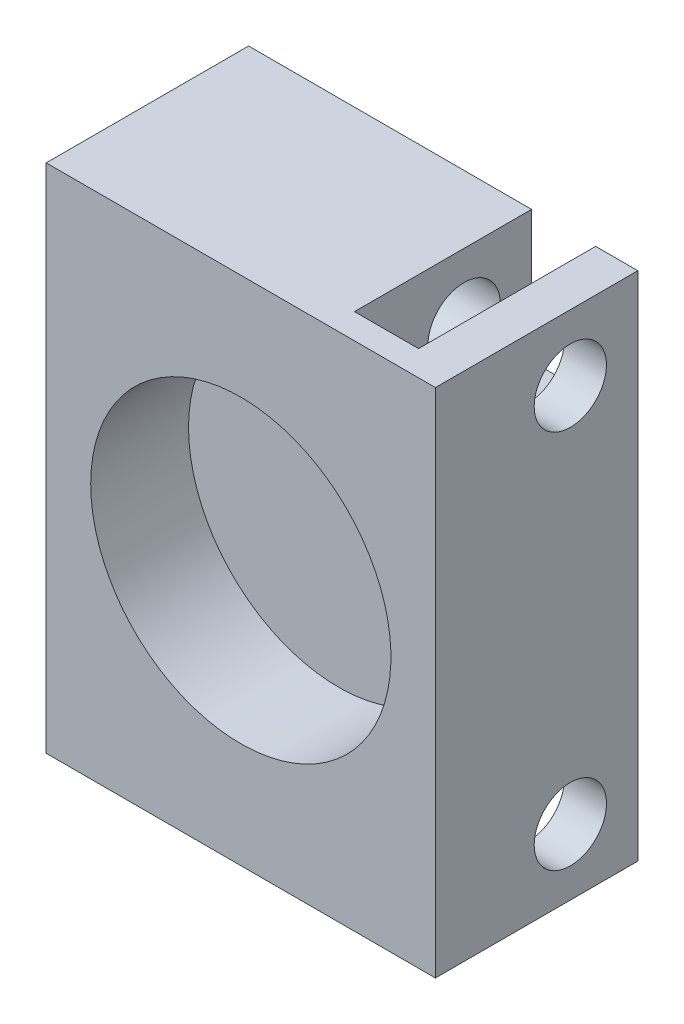
ISO-10303-21;
HEADER;
FILE_DESCRIPTION(('STEP AP214'),'2;1');
FILE_NAME('part.step','',(''),(''),'','','');
FILE_SCHEMA(('AUTOMOTIVE_DESIGN { 1 0 10303 214 1 1 1 1 }'));
ENDSEC;
DATA;
#1=APPLICATION_CONTEXT('core data for automotive mechanical design processes');
#2=APPLICATION_PROTOCOL_DEFINITION('international standard','automotive_design',2000,#1);
#3=PRODUCT_CONTEXT('',#1,'mechanical');
#4=PRODUCT('Part','Part','',(#3));
#5=PRODUCT_RELATED_PRODUCT_CATEGORY('part','',(#4));
#6=PRODUCT_DEFINITION_FORMATION('','',#4);
#7=PRODUCT_DEFINITION_CONTEXT('part definition',#1,'design');
#8=PRODUCT_DEFINITION('design','',#6,#7);
#9=PRODUCT_DEFINITION_SHAPE('','',#8);
#10=(LENGTH_UNIT() NAMED_UNIT(*) SI_UNIT(.MILLI.,.METRE.));
#11=(NAMED_UNIT(*) PLANE_ANGLE_UNIT() SI_UNIT($,.RADIAN.));
#12=(NAMED_UNIT(*) SI_UNIT($,.STERADIAN.) SOLID_ANGLE_UNIT());
#13=UNCERTAINTY_MEASURE_WITH_UNIT(LENGTH_MEASURE(1.E-05),#10,'distance_accuracy_value','');
#14=(GEOMETRIC_REPRESENTATION_CONTEXT(3) GLOBAL_UNCERTAINTY_ASSIGNED_CONTEXT((#13)) GLOBAL_UNIT_ASSIGNED_CONTEXT((#10,
#11,#12)) REPRESENTATION_CONTEXT('',''));
#15=CARTESIAN_POINT('',(0.,0.,0.));
#16=DIRECTION('',(0.,0.,1.));
#17=DIRECTION('',(1.,0.,0.));
#18=AXIS2_PLACEMENT_3D('',#15,#16,#17);
#19=CARTESIAN_POINT('',(0.,0.,0.));
#20=DIRECTION('',(0.,0.,-1.));
#21=DIRECTION('',(-1.,0.,0.));
#22=AXIS2_PLACEMENT_3D('',#19,#20,#21);
#23=PLANE('',#22);
#24=DIRECTION('',(1.,0.,0.));
#25=VECTOR('',#24,1.);
#26=CARTESIAN_POINT('',(-14.6532147419208,-19.2519719410921,0.));
#27=LINE('',#26,#25);
#28=CARTESIAN_POINT('',(11.4782147419208,-19.2519719410921,0.));
#29=VERTEX_POINT('',#28);
#30=CARTESIAN_POINT('',(14.6532147419208,-19.2519719410921,0.));
#31=VERTEX_POINT('',#30);
#32=EDGE_CURVE('E215',#29,#31,#27,.T.);
#33=ORIENTED_EDGE('',*,*,#32,.F.);
#34=DIRECTION('',(0.,1.,0.));
#35=VECTOR('',#34,1.);
#36=CARTESIAN_POINT('',(11.4782147419208,-19.2519719410921,0.));
#37=LINE('',#36,#35);
#38=CARTESIAN_POINT('',(11.4782147419208,-9.34597194109209,0.));
#39=VERTEX_POINT('',#38);
#40=EDGE_CURVE('E431',#29,#39,#37,.T.);
#41=ORIENTED_EDGE('',*,*,#40,.T.);
#42=DIRECTION('',(-1.,0.,0.));
#43=VECTOR('',#42,1.);
#44=CARTESIAN_POINT('',(11.4782147419208,-9.34597194109209,0.));
#45=LINE('',#44,#43);
#46=CARTESIAN_POINT('',(6.65221474192083,-9.34597194109209,0.));
#47=VERTEX_POINT('',#46);
#48=EDGE_CURVE('E439',#39,#47,#45,.T.);
#49=ORIENTED_EDGE('',*,*,#48,.T.);
#50=DIRECTION('',(0.,-1.,0.));
#51=VECTOR('',#50,1.);
#52=CARTESIAN_POINT('',(6.65221474192083,-19.2519719410921,0.));
#53=LINE('',#52,#51);
#54=CARTESIAN_POINT('',(6.65221474192083,-19.2519719410921,0.));
#55=VERTEX_POINT('',#54);
#56=EDGE_CURVE('E434',#47,#55,#53,.T.);
#57=ORIENTED_EDGE('',*,*,#56,.T.);
#58=CARTESIAN_POINT('',(-14.6532147419208,-19.2519719410921,0.));
#59=VERTEX_POINT('',#58);
#60=EDGE_CURVE('E147',#59,#55,#27,.T.);
#61=ORIENTED_EDGE('',*,*,#60,.F.);
#62=DIRECTION('',(0.,-1.,0.));
#63=VECTOR('',#62,1.);
#64=CARTESIAN_POINT('',(-14.6532147419208,-19.2519719410921,0.));
#65=LINE('',#64,#63);
#66=CARTESIAN_POINT('',(-14.6532147419208,19.2519719410921,0.));
#67=VERTEX_POINT('',#66);
#68=EDGE_CURVE('E213',#67,#59,#65,.T.);
#69=ORIENTED_EDGE('',*,*,#68,.F.);
#70=DIRECTION('',(-1.,0.,0.));
#71=VECTOR('',#70,1.);
#72=CARTESIAN_POINT('',(-14.6532147419208,19.2519719410921,0.));
#73=LINE('',#72,#71);
#74=CARTESIAN_POINT('',(6.65221474192083,19.2519719410921,0.));
#75=VERTEX_POINT('',#74);
#76=EDGE_CURVE('E209',#75,#67,#73,.T.);
#77=ORIENTED_EDGE('',*,*,#76,.F.);
#78=DIRECTION('',(0.,1.,0.));
#79=VECTOR('',#78,1.);
#80=CARTESIAN_POINT('',(6.65221474192083,19.2519719410921,0.));
#81=LINE('',#80,#79);
#82=CARTESIAN_POINT('',(6.65221474192083,9.34597194109209,0.));
#83=VERTEX_POINT('',#82);
#84=EDGE_CURVE('E173',#83,#75,#81,.T.);
#85=ORIENTED_EDGE('',*,*,#84,.F.);
#86=DIRECTION('',(-1.,0.,0.));
#87=VECTOR('',#86,1.);
#88=CARTESIAN_POINT('',(11.4782147419208,9.34597194109209,0.));
#89=LINE('',#88,#87);
#90=CARTESIAN_POINT('',(11.4782147419208,9.34597194109209,0.));
#91=VERTEX_POINT('',#90);
#92=EDGE_CURVE('E181',#91,#83,#89,.T.);
#93=ORIENTED_EDGE('',*,*,#92,.F.);
#94=DIRECTION('',(0.,-1.,0.));
#95=VECTOR('',#94,1.);
#96=CARTESIAN_POINT('',(11.4782147419208,19.2519719410921,0.));
#97=LINE('',#96,#95);
#98=CARTESIAN_POINT('',(11.4782147419208,19.2519719410921,0.));
#99=VERTEX_POINT('',#98);
#100=EDGE_CURVE('E168',#99,#91,#97,.T.);
#101=ORIENTED_EDGE('',*,*,#100,.F.);
#102=CARTESIAN_POINT('',(14.6532147419208,19.2519719410921,0.));
#103=VERTEX_POINT('',#102);
#104=EDGE_CURVE('E210',#103,#99,#73,.T.);
#105=ORIENTED_EDGE('',*,*,#104,.F.);
#106=DIRECTION('',(0.,1.,0.));
#107=VECTOR('',#106,1.);
#108=CARTESIAN_POINT('',(14.6532147419208,-19.2519719410921,0.));
#109=LINE('',#108,#107);
#110=EDGE_CURVE('E196',#31,#103,#109,.T.);
#111=ORIENTED_EDGE('',*,*,#110,.F.);
#112=EDGE_LOOP('',(#33,#41,#49,#57,#61,#69,#77,#85,#93,#101,#105,#111));
#113=FACE_BOUND('',#112,.T.);
#114=ADVANCED_FACE('F34',(#113),#23,.T.);
#115=CARTESIAN_POINT('',(-14.6532147419208,-19.2519719410921,15.24));
#116=DIRECTION('',(0.,1.,0.));
#117=DIRECTION('',(0.,0.,1.));
#118=AXIS2_PLACEMENT_3D('',#115,#116,#117);
#119=PLANE('',#118);
#120=DIRECTION('',(0.,0.,-1.));
#121=VECTOR('',#120,1.);
#122=CARTESIAN_POINT('',(11.4782147419208,-19.2519719410921,13.335));
#123=LINE('',#122,#121);
#124=CARTESIAN_POINT('',(11.4782147419208,-19.2519719410921,13.335));
#125=VERTEX_POINT('',#124);
#126=EDGE_CURVE('E148',#125,#29,#123,.T.);
#127=ORIENTED_EDGE('',*,*,#126,.T.);
#128=ORIENTED_EDGE('',*,*,#32,.T.);
#129=DIRECTION('',(0.,0.,-1.));
#130=VECTOR('',#129,1.);
#131=CARTESIAN_POINT('',(14.6532147419208,-19.2519719410921,15.24));
#132=LINE('',#131,#130);
#133=CARTESIAN_POINT('',(14.6532147419208,-19.2519719410921,15.24));
#134=VERTEX_POINT('',#133);
#135=EDGE_CURVE('E206',#134,#31,#132,.T.);
#136=ORIENTED_EDGE('',*,*,#135,.F.);
#137=DIRECTION('',(1.,0.,0.));
#138=VECTOR('',#137,1.);
#139=CARTESIAN_POINT('',(-14.6532147419208,-19.2519719410921,15.24));
#140=LINE('',#139,#138);
#141=CARTESIAN_POINT('',(-14.6532147419208,-19.2519719410921,15.24));
#142=VERTEX_POINT('',#141);
#143=EDGE_CURVE('E204',#142,#134,#140,.T.);
#144=ORIENTED_EDGE('',*,*,#143,.F.);
#145=DIRECTION('',(0.,0.,-1.));
#146=VECTOR('',#145,1.);
#147=CARTESIAN_POINT('',(-14.6532147419208,-19.2519719410921,15.24));
#148=LINE('',#147,#146);
#149=EDGE_CURVE('E219',#142,#59,#148,.T.);
#150=ORIENTED_EDGE('',*,*,#149,.T.);
#151=ORIENTED_EDGE('',*,*,#60,.T.);
#152=DIRECTION('',(0.,0.,-1.));
#153=VECTOR('',#152,1.);
#154=CARTESIAN_POINT('',(6.65221474192083,-19.2519719410921,13.335));
#155=LINE('',#154,#153);
#156=CARTESIAN_POINT('',(6.65221474192083,-19.2519719410921,13.335));
#157=VERTEX_POINT('',#156);
#158=EDGE_CURVE('E132',#157,#55,#155,.T.);
#159=ORIENTED_EDGE('',*,*,#158,.F.);
#160=DIRECTION('',(1.,0.,0.));
#161=VECTOR('',#160,1.);
#162=CARTESIAN_POINT('',(11.4782147419208,-19.2519719410921,13.335));
#163=LINE('',#162,#161);
#164=EDGE_CURVE('E136',#157,#125,#163,.T.);
#165=ORIENTED_EDGE('',*,*,#164,.T.);
#166=EDGE_LOOP('',(#127,#128,#136,#144,#150,#151,#159,#165));
#167=FACE_BOUND('',#166,.T.);
#168=ADVANCED_FACE('F144',(#167),#119,.F.);
#169=CARTESIAN_POINT('',(0.,0.,15.24));
#170=DIRECTION('',(0.,0.,-1.));
#171=DIRECTION('',(-1.,0.,0.));
#172=AXIS2_PLACEMENT_3D('',#169,#170,#171);
#173=CYLINDRICAL_SURFACE('',#172,11.303);
#174=CARTESIAN_POINT('',(0.,0.,15.24));
#175=DIRECTION('',(0.,0.,1.));
#176=DIRECTION('',(1.,0.,0.));
#177=AXIS2_PLACEMENT_3D('',#174,#175,#176);
#178=CIRCLE('',#177,11.303);
#179=CARTESIAN_POINT('',(-11.303,0.,15.24));
#180=VERTEX_POINT('',#179);
#181=EDGE_CURVE('E187',#180,#180,#178,.T.);
#182=CARTESIAN_POINT('',(0.,0.,7.874));
#183=DIRECTION('',(0.,0.,-1.));
#184=DIRECTION('',(-1.,0.,0.));
#185=AXIS2_PLACEMENT_3D('',#182,#183,#184);
#186=CIRCLE('',#185,11.303);
#187=CARTESIAN_POINT('',(-11.303,0.,7.874));
#188=VERTEX_POINT('',#187);
#189=EDGE_CURVE('E165',#188,#188,#186,.T.);
#190=CARTESIAN_POINT('',(-11.303,0.,15.24));
#191=CARTESIAN_POINT('',(-11.303,0.,15.1632708333333));
#192=CARTESIAN_POINT('',(-11.303,0.,15.0865416666667));
#193=CARTESIAN_POINT('',(-11.303,0.,14.9330833333333));
#194=CARTESIAN_POINT('',(-11.303,0.,14.8563541666667));
#195=CARTESIAN_POINT('',(-11.303,0.,14.7028958333333));
#196=CARTESIAN_POINT('',(-11.303,0.,14.6261666666667));
#197=CARTESIAN_POINT('',(-11.303,0.,14.4727083333333));
#198=CARTESIAN_POINT('',(-11.303,0.,14.3959791666667));
#199=CARTESIAN_POINT('',(-11.303,0.,14.2425208333333));
#200=CARTESIAN_POINT('',(-11.303,0.,14.1657916666667));
#201=CARTESIAN_POINT('',(-11.303,0.,14.0123333333333));
#202=CARTESIAN_POINT('',(-11.303,0.,13.9356041666667));
#203=CARTESIAN_POINT('',(-11.303,0.,13.7821458333333));
#204=CARTESIAN_POINT('',(-11.303,0.,13.7054166666667));
#205=CARTESIAN_POINT('',(-11.303,0.,13.5519583333333));
#206=CARTESIAN_POINT('',(-11.303,0.,13.4752291666667));
#207=CARTESIAN_POINT('',(-11.303,0.,13.3217708333333));
#208=CARTESIAN_POINT('',(-11.303,0.,13.2450416666667));
#209=CARTESIAN_POINT('',(-11.303,0.,13.0915833333333));
#210=CARTESIAN_POINT('',(-11.303,0.,13.0148541666667));
#211=CARTESIAN_POINT('',(-11.303,0.,12.8613958333333));
#212=CARTESIAN_POINT('',(-11.303,0.,12.7846666666667));
#213=CARTESIAN_POINT('',(-11.303,0.,12.6312083333333));
#214=CARTESIAN_POINT('',(-11.303,0.,12.5544791666667));
#215=CARTESIAN_POINT('',(-11.303,0.,12.4010208333333));
#216=CARTESIAN_POINT('',(-11.303,0.,12.3242916666667));
#217=CARTESIAN_POINT('',(-11.303,0.,12.1708333333333));
#218=CARTESIAN_POINT('',(-11.303,0.,12.0941041666667));
#219=CARTESIAN_POINT('',(-11.303,0.,11.9406458333333));
#220=CARTESIAN_POINT('',(-11.303,0.,11.8639166666667));
#221=CARTESIAN_POINT('',(-11.303,0.,11.7104583333333));
#222=CARTESIAN_POINT('',(-11.303,0.,11.6337291666667));
#223=CARTESIAN_POINT('',(-11.303,0.,11.4802708333333));
#224=CARTESIAN_POINT('',(-11.303,0.,11.4035416666667));
#225=CARTESIAN_POINT('',(-11.303,0.,11.2500833333333));
#226=CARTESIAN_POINT('',(-11.303,0.,11.1733541666667));
#227=CARTESIAN_POINT('',(-11.303,0.,11.0198958333333));
#228=CARTESIAN_POINT('',(-11.303,0.,10.9431666666667));
#229=CARTESIAN_POINT('',(-11.303,0.,10.7897083333333));
#230=CARTESIAN_POINT('',(-11.303,0.,10.7129791666667));
#231=CARTESIAN_POINT('',(-11.303,0.,10.5595208333333));
#232=CARTESIAN_POINT('',(-11.303,0.,10.4827916666667));
#233=CARTESIAN_POINT('',(-11.303,0.,10.3293333333333));
#234=CARTESIAN_POINT('',(-11.303,0.,10.2526041666667));
#235=CARTESIAN_POINT('',(-11.303,0.,10.0991458333333));
#236=CARTESIAN_POINT('',(-11.303,0.,10.0224166666667));
#237=CARTESIAN_POINT('',(-11.303,0.,9.86895833333333));
#238=CARTESIAN_POINT('',(-11.303,0.,9.79222916666667));
#239=CARTESIAN_POINT('',(-11.303,0.,9.63877083333333));
#240=CARTESIAN_POINT('',(-11.303,0.,9.56204166666667));
#241=CARTESIAN_POINT('',(-11.303,0.,9.40858333333333));
#242=CARTESIAN_POINT('',(-11.303,0.,9.33185416666667));
#243=CARTESIAN_POINT('',(-11.303,0.,9.17839583333333));
#244=CARTESIAN_POINT('',(-11.303,0.,9.10166666666667));
#245=CARTESIAN_POINT('',(-11.303,0.,8.94820833333333));
#246=CARTESIAN_POINT('',(-11.303,0.,8.87147916666667));
#247=CARTESIAN_POINT('',(-11.303,0.,8.71802083333333));
#248=CARTESIAN_POINT('',(-11.303,0.,8.64129166666667));
#249=CARTESIAN_POINT('',(-11.303,0.,8.48783333333333));
#250=CARTESIAN_POINT('',(-11.303,0.,8.41110416666667));
#251=CARTESIAN_POINT('',(-11.303,0.,8.25764583333333));
#252=CARTESIAN_POINT('',(-11.303,0.,8.18091666666667));
#253=CARTESIAN_POINT('',(-11.303,0.,8.02745833333333));
#254=CARTESIAN_POINT('',(-11.303,0.,7.95072916666667));
#255=CARTESIAN_POINT('',(-11.303,0.,7.874));
#256=B_SPLINE_CURVE_WITH_KNOTS('',3,(#190,#191,#192,#193,#194,#195,#196,#197,#198,#199,#200,
#201,#202,#203,#204,#205,#206,#207,#208,#209,#210,#211,#212,#213,#214,#215,#216,#217,#218,#219,
#220,#221,#222,#223,#224,#225,#226,#227,#228,#229,#230,#231,#232,#233,#234,#235,#236,#237,#238,
#239,#240,#241,#242,#243,#244,#245,#246,#247,#248,#249,#250,#251,#252,#253,#254,#255),
.UNSPECIFIED.,.F.,.F.,(4,2,2,2,2,2,2,2,2,2,2,2,2,2,2,2,2,2,2,2,2,2,2,2,2,2,2,2,2,2,2,2,4),(0.,
0.230187500000001,0.460375000000001,0.6905625,0.92075,1.1509375,1.381125,1.6113125,1.8415,
2.0716875,2.301875,2.5320625,2.76225,2.9924375,3.222625,3.4528125,3.683,3.9131875,4.143375,
4.3735625,4.60375,4.8339375,5.064125,5.2943125,5.5245,5.7546875,5.984875,6.2150625,6.44525,
6.6754375,6.905625,7.1358125,7.366),.UNSPECIFIED.);
#257=EDGE_CURVE('BSEAM250',#180,#188,#256,.T.);
#258=ORIENTED_EDGE('',*,*,#181,.T.);
#259=ORIENTED_EDGE('',*,*,#189,.T.);
#260=ORIENTED_EDGE('',*,*,#257,.T.);
#261=ORIENTED_EDGE('',*,*,#257,.F.);
#262=EDGE_LOOP('',(#258,#260,#259,#261));
#263=FACE_BOUND('',#262,.T.);
#264=ADVANCED_FACE('F250',(#263),#173,.F.);
#265=CARTESIAN_POINT('',(0.,0.,15.24));
#266=DIRECTION('',(0.,0.,-1.));
#267=DIRECTION('',(-1.,0.,0.));
#268=AXIS2_PLACEMENT_3D('',#265,#266,#267);
#269=PLANE('',#268);
#270=DIRECTION('',(0.,1.,0.));
#271=VECTOR('',#270,1.);
#272=CARTESIAN_POINT('',(14.6532147419208,-19.2519719410921,15.24));
#273=LINE('',#272,#271);
#274=CARTESIAN_POINT('',(14.6532147419208,19.2519719410921,15.24));
#275=VERTEX_POINT('',#274);
#276=EDGE_CURVE('E197',#134,#275,#273,.T.);
#277=ORIENTED_EDGE('',*,*,#276,.T.);
#278=DIRECTION('',(-1.,0.,0.));
#279=VECTOR('',#278,1.);
#280=CARTESIAN_POINT('',(-14.6532147419208,19.2519719410921,15.24));
#281=LINE('',#280,#279);
#282=CARTESIAN_POINT('',(-14.6532147419208,19.2519719410921,15.24));
#283=VERTEX_POINT('',#282);
#284=EDGE_CURVE('E200',#275,#283,#281,.T.);
#285=ORIENTED_EDGE('',*,*,#284,.T.);
#286=DIRECTION('',(0.,-1.,0.));
#287=VECTOR('',#286,1.);
#288=CARTESIAN_POINT('',(-14.6532147419208,-19.2519719410921,15.24));
#289=LINE('',#288,#287);
#290=EDGE_CURVE('E202',#283,#142,#289,.T.);
#291=ORIENTED_EDGE('',*,*,#290,.T.);
#292=ORIENTED_EDGE('',*,*,#143,.T.);
#293=EDGE_LOOP('',(#277,#285,#291,#292));
#294=FACE_BOUND('',#293,.T.);
#295=ORIENTED_EDGE('',*,*,#181,.F.);
#296=EDGE_LOOP('',(#295));
#297=FACE_BOUND('',#296,.T.);
#298=ADVANCED_FACE('F254',(#294,#297),#269,.F.);
#299=CARTESIAN_POINT('',(14.6532147419208,-19.2519719410921,15.24));
#300=DIRECTION('',(-1.,0.,0.));
#301=DIRECTION('',(0.,0.,1.));
#302=AXIS2_PLACEMENT_3D('',#299,#300,#301);
#303=PLANE('',#302);
#304=CARTESIAN_POINT('',(14.6532147419208,-14.2989719410921,5.08));
#305=DIRECTION('',(-1.,0.,0.));
#306=DIRECTION('',(0.,0.,1.));
#307=AXIS2_PLACEMENT_3D('',#304,#305,#306);
#308=CIRCLE('',#307,2.72177012151882);
#309=CARTESIAN_POINT('',(14.6532147419208,-14.2989719410921,7.80177012151882));
#310=VERTEX_POINT('',#309);
#311=EDGE_CURVE('E430',#310,#310,#308,.F.);
#312=ORIENTED_EDGE('',*,*,#311,.F.);
#313=EDGE_LOOP('',(#312));
#314=FACE_BOUND('',#313,.T.);
#315=CARTESIAN_POINT('',(14.6532147419208,14.2989719410921,5.08));
#316=DIRECTION('',(-1.,0.,0.));
#317=DIRECTION('',(0.,0.,1.));
#318=AXIS2_PLACEMENT_3D('',#315,#316,#317);
#319=CIRCLE('',#318,2.72177012151882);
#320=CARTESIAN_POINT('',(14.6532147419208,14.2989719410921,7.80177012151882));
#321=VERTEX_POINT('',#320);
#322=EDGE_CURVE('E162',#321,#321,#319,.T.);
#323=ORIENTED_EDGE('',*,*,#322,.T.);
#324=EDGE_LOOP('',(#323));
#325=FACE_BOUND('',#324,.T.);
#326=ORIENTED_EDGE('',*,*,#110,.T.);
#327=DIRECTION('',(0.,0.,-1.));
#328=VECTOR('',#327,1.);
#329=CARTESIAN_POINT('',(14.6532147419208,19.2519719410921,15.24));
#330=LINE('',#329,#328);
#331=EDGE_CURVE('E11',#275,#103,#330,.T.);
#332=ORIENTED_EDGE('',*,*,#331,.F.);
#333=ORIENTED_EDGE('',*,*,#276,.F.);
#334=ORIENTED_EDGE('',*,*,#135,.T.);
#335=EDGE_LOOP('',(#326,#332,#333,#334));
#336=FACE_BOUND('',#335,.T.);
#337=ADVANCED_FACE('F36',(#314,#325,#336),#303,.F.);
#338=CARTESIAN_POINT('',(-14.6532147419208,19.2519719410921,15.24));
#339=DIRECTION('',(0.,-1.,0.));
#340=DIRECTION('',(1.,0.,0.));
#341=AXIS2_PLACEMENT_3D('',#338,#339,#340);
#342=PLANE('',#341);
#343=ORIENTED_EDGE('',*,*,#104,.T.);
#344=DIRECTION('',(0.,0.,-1.));
#345=VECTOR('',#344,1.);
#346=CARTESIAN_POINT('',(11.4782147419208,19.2519719410921,13.335));
#347=LINE('',#346,#345);
#348=CARTESIAN_POINT('',(11.4782147419208,19.2519719410921,13.335));
#349=VERTEX_POINT('',#348);
#350=EDGE_CURVE('E185',#349,#99,#347,.T.);
#351=ORIENTED_EDGE('',*,*,#350,.F.);
#352=DIRECTION('',(1.,0.,0.));
#353=VECTOR('',#352,1.);
#354=CARTESIAN_POINT('',(11.4782147419208,19.2519719410921,13.335));
#355=LINE('',#354,#353);
#356=CARTESIAN_POINT('',(6.65221474192084,19.2519719410921,13.335));
#357=VERTEX_POINT('',#356);
#358=EDGE_CURVE('E176',#357,#349,#355,.T.);
#359=ORIENTED_EDGE('',*,*,#358,.F.);
#360=DIRECTION('',(0.,0.,-1.));
#361=VECTOR('',#360,1.);
#362=CARTESIAN_POINT('',(6.65221474192083,19.2519719410921,13.335));
#363=LINE('',#362,#361);
#364=EDGE_CURVE('E188',#357,#75,#363,.T.);
#365=ORIENTED_EDGE('',*,*,#364,.T.);
#366=ORIENTED_EDGE('',*,*,#76,.T.);
#367=DIRECTION('',(0.,0.,-1.));
#368=VECTOR('',#367,1.);
#369=CARTESIAN_POINT('',(-14.6532147419208,19.2519719410921,15.24));
#370=LINE('',#369,#368);
#371=EDGE_CURVE('E43',#283,#67,#370,.T.);
#372=ORIENTED_EDGE('',*,*,#371,.F.);
#373=ORIENTED_EDGE('',*,*,#284,.F.);
#374=ORIENTED_EDGE('',*,*,#331,.T.);
#375=EDGE_LOOP('',(#343,#351,#359,#365,#366,#372,#373,#374));
#376=FACE_BOUND('',#375,.T.);
#377=ADVANCED_FACE('F260',(#376),#342,.F.);
#378=CARTESIAN_POINT('',(-14.6532147419208,-19.2519719410921,15.24));
#379=DIRECTION('',(1.,0.,0.));
#380=DIRECTION('',(0.,0.,-1.));
#381=AXIS2_PLACEMENT_3D('',#378,#379,#380);
#382=PLANE('',#381);
#383=CARTESIAN_POINT('',(-14.6532147419208,-14.2989719410921,5.08));
#384=DIRECTION('',(1.,0.,0.));
#385=DIRECTION('',(0.,0.,1.));
#386=AXIS2_PLACEMENT_3D('',#383,#384,#385);
#387=CIRCLE('',#386,2.72177012151882);
#388=CARTESIAN_POINT('',(-14.6532147419208,-14.2989719410921,7.80177012151882));
#389=VERTEX_POINT('',#388);
#390=EDGE_CURVE('E447',#389,#389,#387,.T.);
#391=ORIENTED_EDGE('',*,*,#390,.T.);
#392=EDGE_LOOP('',(#391));
#393=FACE_BOUND('',#392,.T.);
#394=CARTESIAN_POINT('',(-14.6532147419208,14.2989719410921,5.08));
#395=DIRECTION('',(-1.,0.,0.));
#396=DIRECTION('',(0.,0.,1.));
#397=AXIS2_PLACEMENT_3D('',#394,#395,#396);
#398=CIRCLE('',#397,2.72177012151882);
#399=CARTESIAN_POINT('',(-14.6532147419208,14.2989719410921,7.80177012151882));
#400=VERTEX_POINT('',#399);
#401=EDGE_CURVE('E155',#400,#400,#398,.T.);
#402=ORIENTED_EDGE('',*,*,#401,.F.);
#403=EDGE_LOOP('',(#402));
#404=FACE_BOUND('',#403,.T.);
#405=ORIENTED_EDGE('',*,*,#68,.T.);
#406=ORIENTED_EDGE('',*,*,#149,.F.);
#407=ORIENTED_EDGE('',*,*,#290,.F.);
#408=ORIENTED_EDGE('',*,*,#371,.T.);
#409=EDGE_LOOP('',(#405,#406,#407,#408));
#410=FACE_BOUND('',#409,.T.);
#411=ADVANCED_FACE('F257',(#393,#404,#410),#382,.F.);
#412=CARTESIAN_POINT('',(11.4782147419208,19.2519719410921,13.335));
#413=DIRECTION('',(1.,0.,0.));
#414=DIRECTION('',(0.,1.,0.));
#415=AXIS2_PLACEMENT_3D('',#412,#413,#414);
#416=PLANE('',#415);
#417=CARTESIAN_POINT('',(11.4782147419208,14.2989719410921,5.08));
#418=DIRECTION('',(1.,0.,0.));
#419=DIRECTION('',(0.,1.,0.));
#420=AXIS2_PLACEMENT_3D('',#417,#418,#419);
#421=CIRCLE('',#420,2.72177012151882);
#422=CARTESIAN_POINT('',(11.4782147419208,14.2989719410921,7.80177012151882));
#423=VERTEX_POINT('',#422);
#424=EDGE_CURVE('E159',#423,#423,#421,.T.);
#425=ORIENTED_EDGE('',*,*,#424,.T.);
#426=EDGE_LOOP('',(#425));
#427=FACE_BOUND('',#426,.T.);
#428=ORIENTED_EDGE('',*,*,#100,.T.);
#429=DIRECTION('',(0.,0.,-1.));
#430=VECTOR('',#429,1.);
#431=CARTESIAN_POINT('',(11.4782147419208,9.34597194109209,13.335));
#432=LINE('',#431,#430);
#433=CARTESIAN_POINT('',(11.4782147419208,9.34597194109209,13.335));
#434=VERTEX_POINT('',#433);
#435=EDGE_CURVE('E178',#434,#91,#432,.T.);
#436=ORIENTED_EDGE('',*,*,#435,.F.);
#437=DIRECTION('',(0.,-1.,0.));
#438=VECTOR('',#437,1.);
#439=CARTESIAN_POINT('',(11.4782147419208,19.2519719410921,13.335));
#440=LINE('',#439,#438);
#441=EDGE_CURVE('E169',#349,#434,#440,.T.);
#442=ORIENTED_EDGE('',*,*,#441,.F.);
#443=ORIENTED_EDGE('',*,*,#350,.T.);
#444=EDGE_LOOP('',(#428,#436,#442,#443));
#445=FACE_BOUND('',#444,.T.);
#446=ADVANCED_FACE('F259',(#427,#445),#416,.F.);
#447=CARTESIAN_POINT('',(6.65221474192083,19.2519719410921,13.335));
#448=DIRECTION('',(-1.,0.,0.));
#449=DIRECTION('',(0.,-1.,0.));
#450=AXIS2_PLACEMENT_3D('',#447,#448,#449);
#451=PLANE('',#450);
#452=CARTESIAN_POINT('',(6.65221474192083,14.2989719410921,5.08));
#453=DIRECTION('',(-1.,0.,0.));
#454=DIRECTION('',(0.,-1.,0.));
#455=AXIS2_PLACEMENT_3D('',#452,#453,#454);
#456=CIRCLE('',#455,2.72177012151882);
#457=CARTESIAN_POINT('',(6.65221474192083,11.5772018195733,5.08));
#458=VERTEX_POINT('',#457);
#459=EDGE_CURVE('E158',#458,#458,#456,.T.);
#460=ORIENTED_EDGE('',*,*,#459,.T.);
#461=EDGE_LOOP('',(#460));
#462=FACE_BOUND('',#461,.T.);
#463=ORIENTED_EDGE('',*,*,#84,.T.);
#464=ORIENTED_EDGE('',*,*,#364,.F.);
#465=DIRECTION('',(0.,1.,0.));
#466=VECTOR('',#465,1.);
#467=CARTESIAN_POINT('',(6.65221474192083,19.2519719410921,13.335));
#468=LINE('',#467,#466);
#469=CARTESIAN_POINT('',(6.65221474192083,9.34597194109209,13.335));
#470=VERTEX_POINT('',#469);
#471=EDGE_CURVE('E59',#470,#357,#468,.T.);
#472=ORIENTED_EDGE('',*,*,#471,.F.);
#473=DIRECTION('',(0.,0.,-1.));
#474=VECTOR('',#473,1.);
#475=CARTESIAN_POINT('',(6.65221474192083,9.34597194109209,13.335));
#476=LINE('',#475,#474);
#477=EDGE_CURVE('E191',#470,#83,#476,.T.);
#478=ORIENTED_EDGE('',*,*,#477,.T.);
#479=EDGE_LOOP('',(#463,#464,#472,#478));
#480=FACE_BOUND('',#479,.T.);
#481=ADVANCED_FACE('F225',(#462,#480),#451,.F.);
#482=CARTESIAN_POINT('',(11.4782147419208,9.34597194109209,13.335));
#483=DIRECTION('',(0.,-1.,0.));
#484=DIRECTION('',(1.,0.,0.));
#485=AXIS2_PLACEMENT_3D('',#482,#483,#484);
#486=PLANE('',#485);
#487=ORIENTED_EDGE('',*,*,#92,.T.);
#488=ORIENTED_EDGE('',*,*,#477,.F.);
#489=DIRECTION('',(-1.,0.,0.));
#490=VECTOR('',#489,1.);
#491=CARTESIAN_POINT('',(11.4782147419208,9.34597194109209,13.335));
#492=LINE('',#491,#490);
#493=EDGE_CURVE('E172',#434,#470,#492,.T.);
#494=ORIENTED_EDGE('',*,*,#493,.F.);
#495=ORIENTED_EDGE('',*,*,#435,.T.);
#496=EDGE_LOOP('',(#487,#488,#494,#495));
#497=FACE_BOUND('',#496,.T.);
#498=ADVANCED_FACE('F301',(#497),#486,.F.);
#499=CARTESIAN_POINT('',(0.,0.,13.335));
#500=DIRECTION('',(0.,0.,-1.));
#501=DIRECTION('',(-1.,0.,0.));
#502=AXIS2_PLACEMENT_3D('',#499,#500,#501);
#503=PLANE('',#502);
#504=ORIENTED_EDGE('',*,*,#441,.T.);
#505=ORIENTED_EDGE('',*,*,#493,.T.);
#506=ORIENTED_EDGE('',*,*,#471,.T.);
#507=ORIENTED_EDGE('',*,*,#358,.T.);
#508=EDGE_LOOP('',(#504,#505,#506,#507));
#509=FACE_BOUND('',#508,.T.);
#510=ADVANCED_FACE('F240',(#509),#503,.T.);
#511=CARTESIAN_POINT('',(0.,0.,7.874));
#512=DIRECTION('',(0.,0.,-1.));
#513=DIRECTION('',(-1.,0.,0.));
#514=AXIS2_PLACEMENT_3D('',#511,#512,#513);
#515=PLANE('',#514);
#516=ORIENTED_EDGE('',*,*,#189,.F.);
#517=EDGE_LOOP('',(#516));
#518=FACE_BOUND('',#517,.T.);
#519=ADVANCED_FACE('F231',(#518),#515,.F.);
#520=CARTESIAN_POINT('',(17.0967852580792,14.2989719410921,5.08));
#521=DIRECTION('',(-1.,0.,0.));
#522=DIRECTION('',(0.,0.,1.));
#523=AXIS2_PLACEMENT_3D('',#520,#521,#522);
#524=CYLINDRICAL_SURFACE('',#523,2.72177012151882);
#525=ORIENTED_EDGE('',*,*,#401,.T.);
#526=EDGE_LOOP('',(#525));
#527=FACE_BOUND('',#526,.T.);
#528=ORIENTED_EDGE('',*,*,#459,.F.);
#529=EDGE_LOOP('',(#528));
#530=FACE_BOUND('',#529,.T.);
#531=ADVANCED_FACE('F228',(#527,#530),#524,.F.);
#532=CARTESIAN_POINT('',(11.4782147419208,14.2989719410921,7.80177012151882));
#533=CARTESIAN_POINT('',(11.5112876585875,14.2989719410921,7.80177012151882));
#534=CARTESIAN_POINT('',(11.5443605752542,14.2989719410921,7.80177012151882));
#535=CARTESIAN_POINT('',(11.6105064085875,14.2989719410921,7.80177012151882));
#536=CARTESIAN_POINT('',(11.6435793252542,14.2989719410921,7.80177012151882));
#537=CARTESIAN_POINT('',(11.7097251585875,14.2989719410921,7.80177012151882));
#538=CARTESIAN_POINT('',(11.7427980752542,14.2989719410921,7.80177012151882));
#539=CARTESIAN_POINT('',(11.8089439085875,14.2989719410921,7.80177012151882));
#540=CARTESIAN_POINT('',(11.8420168252542,14.2989719410921,7.80177012151882));
#541=CARTESIAN_POINT('',(11.9081626585875,14.2989719410921,7.80177012151882));
#542=CARTESIAN_POINT('',(11.9412355752542,14.2989719410921,7.80177012151882));
#543=CARTESIAN_POINT('',(12.0073814085875,14.2989719410921,7.80177012151882));
#544=CARTESIAN_POINT('',(12.0404543252542,14.2989719410921,7.80177012151882));
#545=CARTESIAN_POINT('',(12.1066001585875,14.2989719410921,7.80177012151882));
#546=CARTESIAN_POINT('',(12.1396730752542,14.2989719410921,7.80177012151882));
#547=CARTESIAN_POINT('',(12.2058189085875,14.2989719410921,7.80177012151882));
#548=CARTESIAN_POINT('',(12.2388918252542,14.2989719410921,7.80177012151882));
#549=CARTESIAN_POINT('',(12.3050376585875,14.2989719410921,7.80177012151882));
#550=CARTESIAN_POINT('',(12.3381105752542,14.2989719410921,7.80177012151882));
#551=CARTESIAN_POINT('',(12.4042564085875,14.2989719410921,7.80177012151882));
#552=CARTESIAN_POINT('',(12.4373293252542,14.2989719410921,7.80177012151882));
#553=CARTESIAN_POINT('',(12.5034751585875,14.2989719410921,7.80177012151882));
#554=CARTESIAN_POINT('',(12.5365480752542,14.2989719410921,7.80177012151882));
#555=CARTESIAN_POINT('',(12.6026939085875,14.2989719410921,7.80177012151882));
#556=CARTESIAN_POINT('',(12.6357668252542,14.2989719410921,7.80177012151882));
#557=CARTESIAN_POINT('',(12.7019126585875,14.2989719410921,7.80177012151882));
#558=CARTESIAN_POINT('',(12.7349855752542,14.2989719410921,7.80177012151882));
#559=CARTESIAN_POINT('',(12.8011314085875,14.2989719410921,7.80177012151882));
#560=CARTESIAN_POINT('',(12.8342043252542,14.2989719410921,7.80177012151882));
#561=CARTESIAN_POINT('',(12.9003501585875,14.2989719410921,7.80177012151882));
#562=CARTESIAN_POINT('',(12.9334230752542,14.2989719410921,7.80177012151882));
#563=CARTESIAN_POINT('',(12.9995689085875,14.2989719410921,7.80177012151882));
#564=CARTESIAN_POINT('',(13.0326418252542,14.2989719410921,7.80177012151882));
#565=CARTESIAN_POINT('',(13.0987876585875,14.2989719410921,7.80177012151882));
#566=CARTESIAN_POINT('',(13.1318605752542,14.2989719410921,7.80177012151882));
#567=CARTESIAN_POINT('',(13.1980064085875,14.2989719410921,7.80177012151882));
#568=CARTESIAN_POINT('',(13.2310793252542,14.2989719410921,7.80177012151882));
#569=CARTESIAN_POINT('',(13.2972251585875,14.2989719410921,7.80177012151882));
#570=CARTESIAN_POINT('',(13.3302980752542,14.2989719410921,7.80177012151882));
#571=CARTESIAN_POINT('',(13.3964439085875,14.2989719410921,7.80177012151882));
#572=CARTESIAN_POINT('',(13.4295168252542,14.2989719410921,7.80177012151882));
#573=CARTESIAN_POINT('',(13.4956626585875,14.2989719410921,7.80177012151882));
#574=CARTESIAN_POINT('',(13.5287355752542,14.2989719410921,7.80177012151882));
#575=CARTESIAN_POINT('',(13.5948814085875,14.2989719410921,7.80177012151882));
#576=CARTESIAN_POINT('',(13.6279543252542,14.2989719410921,7.80177012151882));
#577=CARTESIAN_POINT('',(13.6941001585875,14.2989719410921,7.80177012151882));
#578=CARTESIAN_POINT('',(13.7271730752542,14.2989719410921,7.80177012151882));
#579=CARTESIAN_POINT('',(13.7933189085875,14.2989719410921,7.80177012151882));
#580=CARTESIAN_POINT('',(13.8263918252542,14.2989719410921,7.80177012151882));
#581=CARTESIAN_POINT('',(13.8925376585875,14.2989719410921,7.80177012151882));
#582=CARTESIAN_POINT('',(13.9256105752542,14.2989719410921,7.80177012151882));
#583=CARTESIAN_POINT('',(13.9917564085875,14.2989719410921,7.80177012151882));
#584=CARTESIAN_POINT('',(14.0248293252542,14.2989719410921,7.80177012151882));
#585=CARTESIAN_POINT('',(14.0909751585875,14.2989719410921,7.80177012151882));
#586=CARTESIAN_POINT('',(14.1240480752542,14.2989719410921,7.80177012151882));
#587=CARTESIAN_POINT('',(14.1901939085875,14.2989719410921,7.80177012151882));
#588=CARTESIAN_POINT('',(14.2232668252542,14.2989719410921,7.80177012151882));
#589=CARTESIAN_POINT('',(14.2894126585875,14.2989719410921,7.80177012151882));
#590=CARTESIAN_POINT('',(14.3224855752542,14.2989719410921,7.80177012151882));
#591=CARTESIAN_POINT('',(14.3886314085875,14.2989719410921,7.80177012151882));
#592=CARTESIAN_POINT('',(14.4217043252542,14.2989719410921,7.80177012151882));
#593=CARTESIAN_POINT('',(14.4878501585875,14.2989719410921,7.80177012151882));
#594=CARTESIAN_POINT('',(14.5209230752542,14.2989719410921,7.80177012151882));
#595=CARTESIAN_POINT('',(14.5870689085875,14.2989719410921,7.80177012151882));
#596=CARTESIAN_POINT('',(14.6201418252542,14.2989719410921,7.80177012151882));
#597=CARTESIAN_POINT('',(14.6532147419208,14.2989719410921,7.80177012151882));
#598=B_SPLINE_CURVE_WITH_KNOTS('',3,(#532,#533,#534,#535,#536,#537,#538,#539,#540,#541,#542,
#543,#544,#545,#546,#547,#548,#549,#550,#551,#552,#553,#554,#555,#556,#557,#558,#559,#560,#561,
#562,#563,#564,#565,#566,#567,#568,#569,#570,#571,#572,#573,#574,#575,#576,#577,#578,#579,#580,
#581,#582,#583,#584,#585,#586,#587,#588,#589,#590,#591,#592,#593,#594,#595,#596,#597),
.UNSPECIFIED.,.F.,.F.,(4,2,2,2,2,2,2,2,2,2,2,2,2,2,2,2,2,2,2,2,2,2,2,2,2,2,2,2,2,2,2,2,4),(0.,
0.0992187499999995,0.198437500000001,0.29765625,0.396875,0.496093750000001,0.5953125,0.69453125,
0.793750000000001,0.892968750000001,0.9921875,1.09140625,1.190625,1.28984375,1.3890625,
1.48828125,1.5875,1.68671875,1.7859375,1.88515625,1.984375,2.08359375,2.1828125,2.28203125,
2.38125,2.48046875,2.5796875,2.67890625,2.778125,2.87734375,2.9765625,3.07578125,3.175),.UNSPECIFIED.);
#599=EDGE_CURVE('BSEAM230',#423,#321,#598,.T.);
#600=ORIENTED_EDGE('',*,*,#424,.F.);
#601=ORIENTED_EDGE('',*,*,#322,.F.);
#602=ORIENTED_EDGE('',*,*,#599,.T.);
#603=ORIENTED_EDGE('',*,*,#599,.F.);
#604=EDGE_LOOP('',(#600,#602,#601,#603));
#605=FACE_BOUND('',#604,.T.);
#606=ADVANCED_FACE('F230',(#605),#524,.F.);
#607=CARTESIAN_POINT('',(11.4782147419208,-19.2519719410921,13.335));
#608=DIRECTION('',(-1.,0.,0.));
#609=DIRECTION('',(0.,-1.,0.));
#610=AXIS2_PLACEMENT_3D('',#607,#608,#609);
#611=PLANE('',#610);
#612=CARTESIAN_POINT('',(11.4782147419208,-14.2989719410921,5.08));
#613=DIRECTION('',(-1.,0.,0.));
#614=DIRECTION('',(0.,-1.,0.));
#615=AXIS2_PLACEMENT_3D('',#612,#613,#614);
#616=CIRCLE('',#615,2.72177012151882);
#617=CARTESIAN_POINT('',(11.4782147419208,-14.2989719410921,7.80177012151882));
#618=VERTEX_POINT('',#617);
#619=EDGE_CURVE('E427',#618,#618,#616,.F.);
#620=ORIENTED_EDGE('',*,*,#619,.T.);
#621=EDGE_LOOP('',(#620));
#622=FACE_BOUND('',#621,.T.);
#623=ORIENTED_EDGE('',*,*,#40,.F.);
#624=ORIENTED_EDGE('',*,*,#126,.F.);
#625=DIRECTION('',(0.,1.,0.));
#626=VECTOR('',#625,1.);
#627=CARTESIAN_POINT('',(11.4782147419208,-19.2519719410921,13.335));
#628=LINE('',#627,#626);
#629=CARTESIAN_POINT('',(11.4782147419208,-9.34597194109209,13.335));
#630=VERTEX_POINT('',#629);
#631=EDGE_CURVE('E51',#125,#630,#628,.T.);
#632=ORIENTED_EDGE('',*,*,#631,.T.);
#633=DIRECTION('',(0.,0.,-1.));
#634=VECTOR('',#633,1.);
#635=CARTESIAN_POINT('',(11.4782147419208,-9.34597194109209,13.335));
#636=LINE('',#635,#634);
#637=EDGE_CURVE('E150',#630,#39,#636,.T.);
#638=ORIENTED_EDGE('',*,*,#637,.T.);
#639=EDGE_LOOP('',(#623,#624,#632,#638));
#640=FACE_BOUND('',#639,.T.);
#641=ADVANCED_FACE('F238',(#622,#640),#611,.T.);
#642=CARTESIAN_POINT('',(11.4782147419208,-9.34597194109209,13.335));
#643=DIRECTION('',(0.,-1.,0.));
#644=DIRECTION('',(1.,0.,0.));
#645=AXIS2_PLACEMENT_3D('',#642,#643,#644);
#646=PLANE('',#645);
#647=ORIENTED_EDGE('',*,*,#48,.F.);
#648=ORIENTED_EDGE('',*,*,#637,.F.);
#649=DIRECTION('',(-1.,0.,0.));
#650=VECTOR('',#649,1.);
#651=CARTESIAN_POINT('',(11.4782147419208,-9.34597194109209,13.335));
#652=LINE('',#651,#650);
#653=CARTESIAN_POINT('',(6.65221474192083,-9.34597194109209,13.335));
#654=VERTEX_POINT('',#653);
#655=EDGE_CURVE('E135',#630,#654,#652,.T.);
#656=ORIENTED_EDGE('',*,*,#655,.T.);
#657=DIRECTION('',(0.,0.,-1.));
#658=VECTOR('',#657,1.);
#659=CARTESIAN_POINT('',(6.65221474192083,-9.34597194109209,13.335));
#660=LINE('',#659,#658);
#661=EDGE_CURVE('E134',#654,#47,#660,.T.);
#662=ORIENTED_EDGE('',*,*,#661,.T.);
#663=EDGE_LOOP('',(#647,#648,#656,#662));
#664=FACE_BOUND('',#663,.T.);
#665=ADVANCED_FACE('F375',(#664),#646,.T.);
#666=CARTESIAN_POINT('',(6.65221474192083,-19.2519719410921,13.335));
#667=DIRECTION('',(1.,0.,0.));
#668=DIRECTION('',(0.,1.,0.));
#669=AXIS2_PLACEMENT_3D('',#666,#667,#668);
#670=PLANE('',#669);
#671=CARTESIAN_POINT('',(6.65221474192083,-14.2989719410921,5.08));
#672=DIRECTION('',(1.,0.,0.));
#673=DIRECTION('',(0.,1.,0.));
#674=AXIS2_PLACEMENT_3D('',#671,#672,#673);
#675=CIRCLE('',#674,2.72177012151882);
#676=CARTESIAN_POINT('',(6.65221474192083,-11.5772018195733,5.08));
#677=VERTEX_POINT('',#676);
#678=EDGE_CURVE('E38',#677,#677,#675,.F.);
#679=ORIENTED_EDGE('',*,*,#678,.T.);
#680=EDGE_LOOP('',(#679));
#681=FACE_BOUND('',#680,.T.);
#682=ORIENTED_EDGE('',*,*,#56,.F.);
#683=ORIENTED_EDGE('',*,*,#661,.F.);
#684=DIRECTION('',(0.,-1.,0.));
#685=VECTOR('',#684,1.);
#686=CARTESIAN_POINT('',(6.65221474192083,-19.2519719410921,13.335));
#687=LINE('',#686,#685);
#688=EDGE_CURVE('E128',#654,#157,#687,.T.);
#689=ORIENTED_EDGE('',*,*,#688,.T.);
#690=ORIENTED_EDGE('',*,*,#158,.T.);
#691=EDGE_LOOP('',(#682,#683,#689,#690));
#692=FACE_BOUND('',#691,.T.);
#693=ADVANCED_FACE('F130',(#681,#692),#670,.T.);
#694=CARTESIAN_POINT('',(0.,0.,13.335));
#695=DIRECTION('',(0.,0.,-1.));
#696=DIRECTION('',(-1.,0.,0.));
#697=AXIS2_PLACEMENT_3D('',#694,#695,#696);
#698=PLANE('',#697);
#699=ORIENTED_EDGE('',*,*,#631,.F.);
#700=ORIENTED_EDGE('',*,*,#164,.F.);
#701=ORIENTED_EDGE('',*,*,#688,.F.);
#702=ORIENTED_EDGE('',*,*,#655,.F.);
#703=EDGE_LOOP('',(#699,#700,#701,#702));
#704=FACE_BOUND('',#703,.T.);
#705=ADVANCED_FACE('F139',(#704),#698,.T.);
#706=CARTESIAN_POINT('',(17.0967852580792,-14.2989719410921,5.08));
#707=DIRECTION('',(-1.,0.,0.));
#708=DIRECTION('',(0.,0.,1.));
#709=AXIS2_PLACEMENT_3D('',#706,#707,#708);
#710=CYLINDRICAL_SURFACE('',#709,2.72177012151882);
#711=ORIENTED_EDGE('',*,*,#678,.F.);
#712=EDGE_LOOP('',(#711));
#713=FACE_BOUND('',#712,.T.);
#714=ORIENTED_EDGE('',*,*,#390,.F.);
#715=EDGE_LOOP('',(#714));
#716=FACE_BOUND('',#715,.T.);
#717=ADVANCED_FACE('F402',(#713,#716),#710,.F.);
#718=CARTESIAN_POINT('',(11.4782147419208,-14.2989719410921,7.80177012151882));
#719=CARTESIAN_POINT('',(11.5112876585875,-14.2989719410921,7.80177012151882));
#720=CARTESIAN_POINT('',(11.5443605752542,-14.2989719410921,7.80177012151882));
#721=CARTESIAN_POINT('',(11.6105064085875,-14.2989719410921,7.80177012151882));
#722=CARTESIAN_POINT('',(11.6435793252542,-14.2989719410921,7.80177012151882));
#723=CARTESIAN_POINT('',(11.7097251585875,-14.2989719410921,7.80177012151882));
#724=CARTESIAN_POINT('',(11.7427980752542,-14.2989719410921,7.80177012151882));
#725=CARTESIAN_POINT('',(11.8089439085875,-14.2989719410921,7.80177012151882));
#726=CARTESIAN_POINT('',(11.8420168252542,-14.2989719410921,7.80177012151882));
#727=CARTESIAN_POINT('',(11.9081626585875,-14.2989719410921,7.80177012151882));
#728=CARTESIAN_POINT('',(11.9412355752542,-14.2989719410921,7.80177012151882));
#729=CARTESIAN_POINT('',(12.0073814085875,-14.2989719410921,7.80177012151882));
#730=CARTESIAN_POINT('',(12.0404543252542,-14.2989719410921,7.80177012151882));
#731=CARTESIAN_POINT('',(12.1066001585875,-14.2989719410921,7.80177012151882));
#732=CARTESIAN_POINT('',(12.1396730752542,-14.2989719410921,7.80177012151882));
#733=CARTESIAN_POINT('',(12.2058189085875,-14.2989719410921,7.80177012151882));
#734=CARTESIAN_POINT('',(12.2388918252542,-14.2989719410921,7.80177012151882));
#735=CARTESIAN_POINT('',(12.3050376585875,-14.2989719410921,7.80177012151882));
#736=CARTESIAN_POINT('',(12.3381105752542,-14.2989719410921,7.80177012151882));
#737=CARTESIAN_POINT('',(12.4042564085875,-14.2989719410921,7.80177012151882));
#738=CARTESIAN_POINT('',(12.4373293252542,-14.2989719410921,7.80177012151882));
#739=CARTESIAN_POINT('',(12.5034751585875,-14.2989719410921,7.80177012151882));
#740=CARTESIAN_POINT('',(12.5365480752542,-14.2989719410921,7.80177012151882));
#741=CARTESIAN_POINT('',(12.6026939085875,-14.2989719410921,7.80177012151882));
#742=CARTESIAN_POINT('',(12.6357668252542,-14.2989719410921,7.80177012151882));
#743=CARTESIAN_POINT('',(12.7019126585875,-14.2989719410921,7.80177012151882));
#744=CARTESIAN_POINT('',(12.7349855752542,-14.2989719410921,7.80177012151882));
#745=CARTESIAN_POINT('',(12.8011314085875,-14.2989719410921,7.80177012151882));
#746=CARTESIAN_POINT('',(12.8342043252542,-14.2989719410921,7.80177012151882));
#747=CARTESIAN_POINT('',(12.9003501585875,-14.2989719410921,7.80177012151882));
#748=CARTESIAN_POINT('',(12.9334230752542,-14.2989719410921,7.80177012151882));
#749=CARTESIAN_POINT('',(12.9995689085875,-14.2989719410921,7.80177012151882));
#750=CARTESIAN_POINT('',(13.0326418252542,-14.2989719410921,7.80177012151882));
#751=CARTESIAN_POINT('',(13.0987876585875,-14.2989719410921,7.80177012151882));
#752=CARTESIAN_POINT('',(13.1318605752542,-14.2989719410921,7.80177012151882));
#753=CARTESIAN_POINT('',(13.1980064085875,-14.2989719410921,7.80177012151882));
#754=CARTESIAN_POINT('',(13.2310793252542,-14.2989719410921,7.80177012151882));
#755=CARTESIAN_POINT('',(13.2972251585875,-14.2989719410921,7.80177012151882));
#756=CARTESIAN_POINT('',(13.3302980752542,-14.2989719410921,7.80177012151882));
#757=CARTESIAN_POINT('',(13.3964439085875,-14.2989719410921,7.80177012151882));
#758=CARTESIAN_POINT('',(13.4295168252542,-14.2989719410921,7.80177012151882));
#759=CARTESIAN_POINT('',(13.4956626585875,-14.2989719410921,7.80177012151882));
#760=CARTESIAN_POINT('',(13.5287355752542,-14.2989719410921,7.80177012151882));
#761=CARTESIAN_POINT('',(13.5948814085875,-14.2989719410921,7.80177012151882));
#762=CARTESIAN_POINT('',(13.6279543252542,-14.2989719410921,7.80177012151882));
#763=CARTESIAN_POINT('',(13.6941001585875,-14.2989719410921,7.80177012151882));
#764=CARTESIAN_POINT('',(13.7271730752542,-14.2989719410921,7.80177012151882));
#765=CARTESIAN_POINT('',(13.7933189085875,-14.2989719410921,7.80177012151882));
#766=CARTESIAN_POINT('',(13.8263918252542,-14.2989719410921,7.80177012151882));
#767=CARTESIAN_POINT('',(13.8925376585875,-14.2989719410921,7.80177012151882));
#768=CARTESIAN_POINT('',(13.9256105752542,-14.2989719410921,7.80177012151882));
#769=CARTESIAN_POINT('',(13.9917564085875,-14.2989719410921,7.80177012151882));
#770=CARTESIAN_POINT('',(14.0248293252542,-14.2989719410921,7.80177012151882));
#771=CARTESIAN_POINT('',(14.0909751585875,-14.2989719410921,7.80177012151882));
#772=CARTESIAN_POINT('',(14.1240480752542,-14.2989719410921,7.80177012151882));
#773=CARTESIAN_POINT('',(14.1901939085875,-14.2989719410921,7.80177012151882));
#774=CARTESIAN_POINT('',(14.2232668252542,-14.2989719410921,7.80177012151882));
#775=CARTESIAN_POINT('',(14.2894126585875,-14.2989719410921,7.80177012151882));
#776=CARTESIAN_POINT('',(14.3224855752542,-14.2989719410921,7.80177012151882));
#777=CARTESIAN_POINT('',(14.3886314085875,-14.2989719410921,7.80177012151882));
#778=CARTESIAN_POINT('',(14.4217043252542,-14.2989719410921,7.80177012151882));
#779=CARTESIAN_POINT('',(14.4878501585875,-14.2989719410921,7.80177012151882));
#780=CARTESIAN_POINT('',(14.5209230752542,-14.2989719410921,7.80177012151882));
#781=CARTESIAN_POINT('',(14.5870689085875,-14.2989719410921,7.80177012151882));
#782=CARTESIAN_POINT('',(14.6201418252542,-14.2989719410921,7.80177012151882));
#783=CARTESIAN_POINT('',(14.6532147419208,-14.2989719410921,7.80177012151882));
#784=B_SPLINE_CURVE_WITH_KNOTS('',3,(#718,#719,#720,#721,#722,#723,#724,#725,#726,#727,#728,
#729,#730,#731,#732,#733,#734,#735,#736,#737,#738,#739,#740,#741,#742,#743,#744,#745,#746,#747,
#748,#749,#750,#751,#752,#753,#754,#755,#756,#757,#758,#759,#760,#761,#762,#763,#764,#765,#766,
#767,#768,#769,#770,#771,#772,#773,#774,#775,#776,#777,#778,#779,#780,#781,#782,#783),
.UNSPECIFIED.,.F.,.F.,(4,2,2,2,2,2,2,2,2,2,2,2,2,2,2,2,2,2,2,2,2,2,2,2,2,2,2,2,2,2,2,2,4),(0.,
0.0992187499999995,0.198437500000001,0.29765625,0.396875,0.496093750000001,0.5953125,0.69453125,
0.793750000000001,0.892968749999999,0.9921875,1.09140625,1.190625,1.28984375,1.3890625,
1.48828125,1.5875,1.68671875,1.7859375,1.88515625,1.984375,2.08359375,2.1828125,2.28203125,
2.38125,2.48046875,2.5796875,2.67890625,2.778125,2.87734375,2.9765625,3.07578125,3.175),.UNSPECIFIED.);
#785=EDGE_CURVE('BSEAM411',#618,#310,#784,.T.);
#786=ORIENTED_EDGE('',*,*,#619,.F.);
#787=ORIENTED_EDGE('',*,*,#311,.T.);
#788=ORIENTED_EDGE('',*,*,#785,.T.);
#789=ORIENTED_EDGE('',*,*,#785,.F.);
#790=EDGE_LOOP('',(#786,#788,#787,#789));
#791=FACE_BOUND('',#790,.T.);
#792=ADVANCED_FACE('F411',(#791),#710,.F.);
#793=CLOSED_SHELL('',(#114,#168,#264,#298,#337,#377,#411,#446,#481,#498,#510,#519,#531,#606,
#641,#665,#693,#705,#717,#792));
#794=MANIFOLD_SOLID_BREP('B2',#793);
#795=ADVANCED_BREP_SHAPE_REPRESENTATION('',(#18,#794),#14);
#796=SHAPE_DEFINITION_REPRESENTATION(#9,#795);
ENDSEC;
END-ISO-10303-21;
